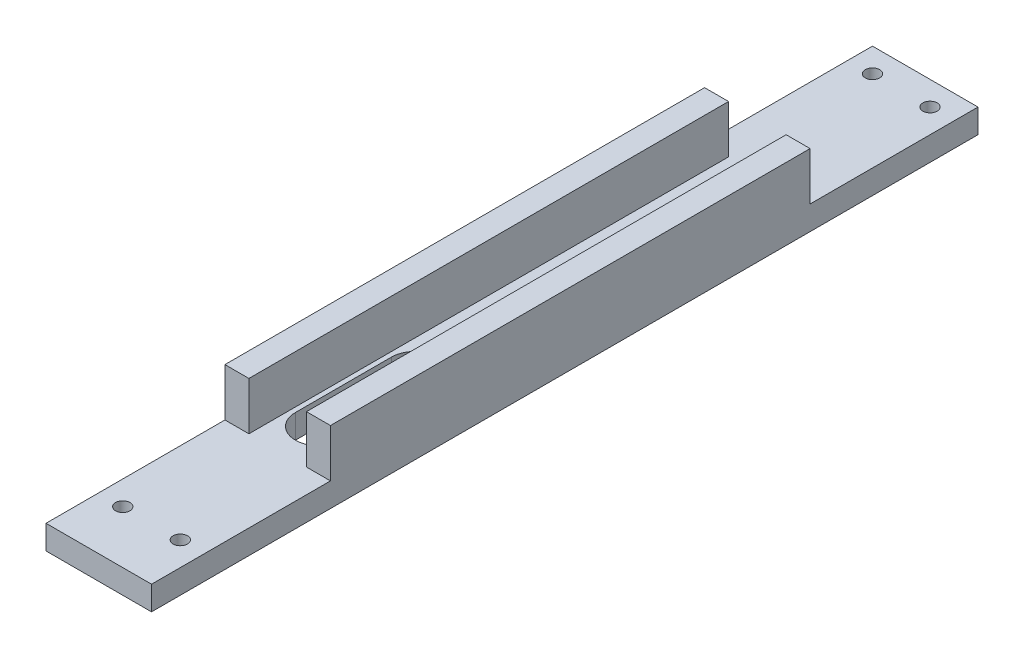
ISO-10303-21;
HEADER;
FILE_DESCRIPTION(('STEP AP214'),'2;1');
FILE_NAME('part.step','',(''),(''),'','','');
FILE_SCHEMA(('AUTOMOTIVE_DESIGN { 1 0 10303 214 1 1 1 1 }'));
ENDSEC;
DATA;
#1=APPLICATION_CONTEXT('core data for automotive mechanical design processes');
#2=APPLICATION_PROTOCOL_DEFINITION('international standard','automotive_design',2000,#1);
#3=PRODUCT_CONTEXT('',#1,'mechanical');
#4=PRODUCT('Part','Part','',(#3));
#5=PRODUCT_RELATED_PRODUCT_CATEGORY('part','',(#4));
#6=PRODUCT_DEFINITION_FORMATION('','',#4);
#7=PRODUCT_DEFINITION_CONTEXT('part definition',#1,'design');
#8=PRODUCT_DEFINITION('design','',#6,#7);
#9=PRODUCT_DEFINITION_SHAPE('','',#8);
#10=(LENGTH_UNIT() NAMED_UNIT(*) SI_UNIT(.MILLI.,.METRE.));
#11=(NAMED_UNIT(*) PLANE_ANGLE_UNIT() SI_UNIT($,.RADIAN.));
#12=(NAMED_UNIT(*) SI_UNIT($,.STERADIAN.) SOLID_ANGLE_UNIT());
#13=UNCERTAINTY_MEASURE_WITH_UNIT(LENGTH_MEASURE(1.E-05),#10,'distance_accuracy_value','');
#14=(GEOMETRIC_REPRESENTATION_CONTEXT(3) GLOBAL_UNCERTAINTY_ASSIGNED_CONTEXT((#13)) GLOBAL_UNIT_ASSIGNED_CONTEXT((#10,
#11,#12)) REPRESENTATION_CONTEXT('',''));
#15=CARTESIAN_POINT('',(0.,0.,0.));
#16=DIRECTION('',(0.,0.,1.));
#17=DIRECTION('',(1.,0.,0.));
#18=AXIS2_PLACEMENT_3D('',#15,#16,#17);
#19=CARTESIAN_POINT('',(0.,5.,0.));
#20=DIRECTION('',(0.,1.,0.));
#21=DIRECTION('',(0.,0.,1.));
#22=AXIS2_PLACEMENT_3D('',#19,#20,#21);
#23=PLANE('',#22);
#24=DIRECTION('',(0.,0.,-1.));
#25=VECTOR('',#24,1.);
#26=CARTESIAN_POINT('',(6.,5.,0.));
#27=LINE('',#26,#25);
#28=CARTESIAN_POINT('',(6.,5.,-40.));
#29=VERTEX_POINT('',#28);
#30=CARTESIAN_POINT('',(6.,5.,-60.));
#31=VERTEX_POINT('',#30);
#32=EDGE_CURVE('E225',#29,#31,#27,.T.);
#33=ORIENTED_EDGE('',*,*,#32,.T.);
#34=CARTESIAN_POINT('',(11.,5.,-60.));
#35=DIRECTION('',(0.,-1.,0.));
#36=DIRECTION('',(0.,0.,-1.));
#37=AXIS2_PLACEMENT_3D('',#34,#35,#36);
#38=CIRCLE('',#37,5.);
#39=CARTESIAN_POINT('',(16.,5.,-60.));
#40=VERTEX_POINT('',#39);
#41=EDGE_CURVE('E228',#31,#40,#38,.T.);
#42=ORIENTED_EDGE('',*,*,#41,.T.);
#43=DIRECTION('',(0.,0.,-1.));
#44=VECTOR('',#43,1.);
#45=CARTESIAN_POINT('',(16.,5.,0.));
#46=LINE('',#45,#44);
#47=CARTESIAN_POINT('',(16.,5.,-40.));
#48=VERTEX_POINT('',#47);
#49=EDGE_CURVE('E232',#48,#40,#46,.T.);
#50=ORIENTED_EDGE('',*,*,#49,.F.);
#51=CARTESIAN_POINT('',(11.,5.,-40.));
#52=DIRECTION('',(0.,-1.,0.));
#53=DIRECTION('',(0.,0.,-1.));
#54=AXIS2_PLACEMENT_3D('',#51,#52,#53);
#55=CIRCLE('',#54,5.);
#56=EDGE_CURVE('E235',#48,#29,#55,.T.);
#57=ORIENTED_EDGE('',*,*,#56,.T.);
#58=EDGE_LOOP('',(#33,#42,#50,#57));
#59=FACE_BOUND('',#58,.T.);
#60=CARTESIAN_POINT('',(17.,5.,-161.3));
#61=DIRECTION('',(0.,1.,0.));
#62=DIRECTION('',(0.,0.,1.));
#63=AXIS2_PLACEMENT_3D('',#60,#61,#62);
#64=CIRCLE('',#63,1.5);
#65=CARTESIAN_POINT('',(17.,5.,-159.8));
#66=VERTEX_POINT('',#65);
#67=EDGE_CURVE('E257',#66,#66,#64,.T.);
#68=ORIENTED_EDGE('',*,*,#67,.F.);
#69=EDGE_LOOP('',(#68));
#70=FACE_BOUND('',#69,.T.);
#71=CARTESIAN_POINT('',(5.,5.,-161.3));
#72=DIRECTION('',(0.,1.,0.));
#73=DIRECTION('',(0.,0.,1.));
#74=AXIS2_PLACEMENT_3D('',#71,#72,#73);
#75=CIRCLE('',#74,1.5);
#76=CARTESIAN_POINT('',(5.,5.,-159.8));
#77=VERTEX_POINT('',#76);
#78=EDGE_CURVE('E156',#77,#77,#75,.T.);
#79=ORIENTED_EDGE('',*,*,#78,.F.);
#80=EDGE_LOOP('',(#79));
#81=FACE_BOUND('',#80,.T.);
#82=CARTESIAN_POINT('',(17.,5.,-5.));
#83=DIRECTION('',(0.,1.,0.));
#84=DIRECTION('',(0.,0.,1.));
#85=AXIS2_PLACEMENT_3D('',#82,#83,#84);
#86=CIRCLE('',#85,1.5);
#87=CARTESIAN_POINT('',(17.,5.,-3.5));
#88=VERTEX_POINT('',#87);
#89=EDGE_CURVE('E269',#88,#88,#86,.F.);
#90=ORIENTED_EDGE('',*,*,#89,.T.);
#91=EDGE_LOOP('',(#90));
#92=FACE_BOUND('',#91,.T.);
#93=CARTESIAN_POINT('',(5.,5.,-5.));
#94=DIRECTION('',(0.,1.,0.));
#95=DIRECTION('',(0.,0.,1.));
#96=AXIS2_PLACEMENT_3D('',#93,#94,#95);
#97=CIRCLE('',#96,1.5);
#98=CARTESIAN_POINT('',(5.,5.,-3.5));
#99=VERTEX_POINT('',#98);
#100=EDGE_CURVE('E272',#99,#99,#97,.F.);
#101=ORIENTED_EDGE('',*,*,#100,.T.);
#102=EDGE_LOOP('',(#101));
#103=FACE_BOUND('',#102,.T.);
#104=DIRECTION('',(0.,0.,1.));
#105=VECTOR('',#104,1.);
#106=CARTESIAN_POINT('',(17.,5.,-131.3));
#107=LINE('',#106,#105);
#108=CARTESIAN_POINT('',(17.,5.,-131.3));
#109=VERTEX_POINT('',#108);
#110=CARTESIAN_POINT('',(17.,5.,-31.3));
#111=VERTEX_POINT('',#110);
#112=EDGE_CURVE('E50',#109,#111,#107,.T.);
#113=ORIENTED_EDGE('',*,*,#112,.F.);
#114=DIRECTION('',(-1.,0.,0.));
#115=VECTOR('',#114,1.);
#116=CARTESIAN_POINT('',(22.,5.,-131.3));
#117=LINE('',#116,#115);
#118=CARTESIAN_POINT('',(22.,5.,-131.3));
#119=VERTEX_POINT('',#118);
#120=EDGE_CURVE('E159',#119,#109,#117,.T.);
#121=ORIENTED_EDGE('',*,*,#120,.F.);
#122=DIRECTION('',(0.,0.,-1.));
#123=VECTOR('',#122,1.);
#124=CARTESIAN_POINT('',(22.,5.,0.));
#125=LINE('',#124,#123);
#126=CARTESIAN_POINT('',(22.,5.,-166.3));
#127=VERTEX_POINT('',#126);
#128=EDGE_CURVE('E146',#119,#127,#125,.T.);
#129=ORIENTED_EDGE('',*,*,#128,.T.);
#130=DIRECTION('',(1.,0.,0.));
#131=VECTOR('',#130,1.);
#132=CARTESIAN_POINT('',(0.,5.,-166.3));
#133=LINE('',#132,#131);
#134=CARTESIAN_POINT('',(0.,5.,-166.3));
#135=VERTEX_POINT('',#134);
#136=EDGE_CURVE('E263',#135,#127,#133,.T.);
#137=ORIENTED_EDGE('',*,*,#136,.F.);
#138=DIRECTION('',(0.,0.,-1.));
#139=VECTOR('',#138,1.);
#140=CARTESIAN_POINT('',(0.,5.,0.));
#141=LINE('',#140,#139);
#142=CARTESIAN_POINT('',(0.,5.,-131.3));
#143=VERTEX_POINT('',#142);
#144=EDGE_CURVE('E265',#143,#135,#141,.T.);
#145=ORIENTED_EDGE('',*,*,#144,.F.);
#146=DIRECTION('',(1.,0.,0.));
#147=VECTOR('',#146,1.);
#148=CARTESIAN_POINT('',(0.,5.,-131.3));
#149=LINE('',#148,#147);
#150=CARTESIAN_POINT('',(5.,5.,-131.3));
#151=VERTEX_POINT('',#150);
#152=EDGE_CURVE('E199',#143,#151,#149,.T.);
#153=ORIENTED_EDGE('',*,*,#152,.T.);
#154=DIRECTION('',(0.,0.,1.));
#155=VECTOR('',#154,1.);
#156=CARTESIAN_POINT('',(5.00000000000002,5.,0.));
#157=LINE('',#156,#155);
#158=CARTESIAN_POINT('',(5.00000000000001,5.,-31.3));
#159=VERTEX_POINT('',#158);
#160=EDGE_CURVE('E162',#151,#159,#157,.T.);
#161=ORIENTED_EDGE('',*,*,#160,.T.);
#162=DIRECTION('',(1.,0.,0.));
#163=VECTOR('',#162,1.);
#164=CARTESIAN_POINT('',(0.,5.,-31.3));
#165=LINE('',#164,#163);
#166=CARTESIAN_POINT('',(0.,5.,-31.3));
#167=VERTEX_POINT('',#166);
#168=EDGE_CURVE('E189',#167,#159,#165,.T.);
#169=ORIENTED_EDGE('',*,*,#168,.F.);
#170=CARTESIAN_POINT('',(0.,5.,6.));
#171=VERTEX_POINT('',#170);
#172=EDGE_CURVE('E266',#171,#167,#141,.T.);
#173=ORIENTED_EDGE('',*,*,#172,.F.);
#174=DIRECTION('',(-1.,0.,0.));
#175=VECTOR('',#174,1.);
#176=CARTESIAN_POINT('',(22.,5.,6.));
#177=LINE('',#176,#175);
#178=CARTESIAN_POINT('',(22.,5.,6.));
#179=VERTEX_POINT('',#178);
#180=EDGE_CURVE('E215',#179,#171,#177,.T.);
#181=ORIENTED_EDGE('',*,*,#180,.F.);
#182=CARTESIAN_POINT('',(22.,5.,-31.3));
#183=VERTEX_POINT('',#182);
#184=EDGE_CURVE('E155',#179,#183,#125,.T.);
#185=ORIENTED_EDGE('',*,*,#184,.T.);
#186=DIRECTION('',(-1.,0.,0.));
#187=VECTOR('',#186,1.);
#188=CARTESIAN_POINT('',(22.,5.,-31.3));
#189=LINE('',#188,#187);
#190=EDGE_CURVE('E55',#183,#111,#189,.T.);
#191=ORIENTED_EDGE('',*,*,#190,.T.);
#192=EDGE_LOOP('',(#113,#121,#129,#137,#145,#153,#161,#169,#173,#181,#185,#191));
#193=FACE_BOUND('',#192,.T.);
#194=ADVANCED_FACE('F35',(#59,#70,#81,#92,#103,#193),#23,.T.);
#195=CARTESIAN_POINT('',(22.,5.,0.));
#196=DIRECTION('',(-1.,0.,0.));
#197=DIRECTION('',(0.,0.,1.));
#198=AXIS2_PLACEMENT_3D('',#195,#196,#197);
#199=PLANE('',#198);
#200=DIRECTION('',(0.,0.,-1.));
#201=VECTOR('',#200,1.);
#202=CARTESIAN_POINT('',(22.,0.,0.));
#203=LINE('',#202,#201);
#204=CARTESIAN_POINT('',(22.,0.,6.));
#205=VERTEX_POINT('',#204);
#206=CARTESIAN_POINT('',(22.,0.,-166.3));
#207=VERTEX_POINT('',#206);
#208=EDGE_CURVE('E280',#205,#207,#203,.T.);
#209=ORIENTED_EDGE('',*,*,#208,.T.);
#210=DIRECTION('',(0.,-1.,0.));
#211=VECTOR('',#210,1.);
#212=CARTESIAN_POINT('',(22.,5.,-166.3));
#213=LINE('',#212,#211);
#214=EDGE_CURVE('E11',#127,#207,#213,.T.);
#215=ORIENTED_EDGE('',*,*,#214,.F.);
#216=ORIENTED_EDGE('',*,*,#128,.F.);
#217=DIRECTION('',(0.,-1.,0.));
#218=VECTOR('',#217,1.);
#219=CARTESIAN_POINT('',(22.,15.,-131.3));
#220=LINE('',#219,#218);
#221=CARTESIAN_POINT('',(22.,15.,-131.3));
#222=VERTEX_POINT('',#221);
#223=EDGE_CURVE('E151',#222,#119,#220,.T.);
#224=ORIENTED_EDGE('',*,*,#223,.F.);
#225=DIRECTION('',(0.,0.,1.));
#226=VECTOR('',#225,1.);
#227=CARTESIAN_POINT('',(22.,15.,-131.3));
#228=LINE('',#227,#226);
#229=CARTESIAN_POINT('',(22.,15.,-31.3));
#230=VERTEX_POINT('',#229);
#231=EDGE_CURVE('E168',#222,#230,#228,.T.);
#232=ORIENTED_EDGE('',*,*,#231,.T.);
#233=DIRECTION('',(0.,-1.,0.));
#234=VECTOR('',#233,1.);
#235=CARTESIAN_POINT('',(22.,15.,-31.3));
#236=LINE('',#235,#234);
#237=EDGE_CURVE('E169',#230,#183,#236,.T.);
#238=ORIENTED_EDGE('',*,*,#237,.T.);
#239=ORIENTED_EDGE('',*,*,#184,.F.);
#240=DIRECTION('',(0.,1.,0.));
#241=VECTOR('',#240,1.);
#242=CARTESIAN_POINT('',(22.,0.,6.));
#243=LINE('',#242,#241);
#244=EDGE_CURVE('E212',#205,#179,#243,.T.);
#245=ORIENTED_EDGE('',*,*,#244,.F.);
#246=EDGE_LOOP('',(#209,#215,#216,#224,#232,#238,#239,#245));
#247=FACE_BOUND('',#246,.T.);
#248=ADVANCED_FACE('F148',(#247),#199,.F.);
#249=CARTESIAN_POINT('',(0.,5.,-166.3));
#250=DIRECTION('',(0.,0.,-1.));
#251=DIRECTION('',(-1.,0.,0.));
#252=AXIS2_PLACEMENT_3D('',#249,#250,#251);
#253=PLANE('',#252);
#254=DIRECTION('',(1.,0.,0.));
#255=VECTOR('',#254,1.);
#256=CARTESIAN_POINT('',(0.,0.,-166.3));
#257=LINE('',#256,#255);
#258=CARTESIAN_POINT('',(0.,0.,-166.3));
#259=VERTEX_POINT('',#258);
#260=EDGE_CURVE('E282',#259,#207,#257,.T.);
#261=ORIENTED_EDGE('',*,*,#260,.F.);
#262=DIRECTION('',(0.,-1.,0.));
#263=VECTOR('',#262,1.);
#264=CARTESIAN_POINT('',(0.,5.,-166.3));
#265=LINE('',#264,#263);
#266=EDGE_CURVE('E43',#135,#259,#265,.T.);
#267=ORIENTED_EDGE('',*,*,#266,.F.);
#268=ORIENTED_EDGE('',*,*,#136,.T.);
#269=ORIENTED_EDGE('',*,*,#214,.T.);
#270=EDGE_LOOP('',(#261,#267,#268,#269));
#271=FACE_BOUND('',#270,.T.);
#272=ADVANCED_FACE('F299',(#271),#253,.T.);
#273=CARTESIAN_POINT('',(0.,5.,0.));
#274=DIRECTION('',(-1.,0.,0.));
#275=DIRECTION('',(0.,0.,1.));
#276=AXIS2_PLACEMENT_3D('',#273,#274,#275);
#277=PLANE('',#276);
#278=DIRECTION('',(0.,0.,-1.));
#279=VECTOR('',#278,1.);
#280=CARTESIAN_POINT('',(0.,0.,0.));
#281=LINE('',#280,#279);
#282=CARTESIAN_POINT('',(0.,0.,6.));
#283=VERTEX_POINT('',#282);
#284=EDGE_CURVE('E285',#283,#259,#281,.T.);
#285=ORIENTED_EDGE('',*,*,#284,.F.);
#286=DIRECTION('',(0.,-1.,0.));
#287=VECTOR('',#286,1.);
#288=CARTESIAN_POINT('',(0.,0.,6.));
#289=LINE('',#288,#287);
#290=EDGE_CURVE('E218',#171,#283,#289,.T.);
#291=ORIENTED_EDGE('',*,*,#290,.F.);
#292=ORIENTED_EDGE('',*,*,#172,.T.);
#293=DIRECTION('',(0.,-1.,0.));
#294=VECTOR('',#293,1.);
#295=CARTESIAN_POINT('',(0.,15.,-31.3));
#296=LINE('',#295,#294);
#297=CARTESIAN_POINT('',(0.,15.,-31.3));
#298=VERTEX_POINT('',#297);
#299=EDGE_CURVE('E205',#298,#167,#296,.T.);
#300=ORIENTED_EDGE('',*,*,#299,.F.);
#301=DIRECTION('',(0.,0.,1.));
#302=VECTOR('',#301,1.);
#303=CARTESIAN_POINT('',(0.,15.,0.));
#304=LINE('',#303,#302);
#305=CARTESIAN_POINT('',(0.,15.,-131.3));
#306=VERTEX_POINT('',#305);
#307=EDGE_CURVE('E192',#306,#298,#304,.T.);
#308=ORIENTED_EDGE('',*,*,#307,.F.);
#309=DIRECTION('',(0.,-1.,0.));
#310=VECTOR('',#309,1.);
#311=CARTESIAN_POINT('',(0.,15.,-131.3));
#312=LINE('',#311,#310);
#313=EDGE_CURVE('E207',#306,#143,#312,.T.);
#314=ORIENTED_EDGE('',*,*,#313,.T.);
#315=ORIENTED_EDGE('',*,*,#144,.T.);
#316=ORIENTED_EDGE('',*,*,#266,.T.);
#317=EDGE_LOOP('',(#285,#291,#292,#300,#308,#314,#315,#316));
#318=FACE_BOUND('',#317,.T.);
#319=ADVANCED_FACE('F295',(#318),#277,.T.);
#320=CARTESIAN_POINT('',(17.,5.,-5.));
#321=DIRECTION('',(0.,-1.,0.));
#322=DIRECTION('',(0.,0.,-1.));
#323=AXIS2_PLACEMENT_3D('',#320,#321,#322);
#324=CYLINDRICAL_SURFACE('',#323,1.5);
#325=ORIENTED_EDGE('',*,*,#89,.F.);
#326=EDGE_LOOP('',(#325));
#327=FACE_BOUND('',#326,.T.);
#328=CARTESIAN_POINT('',(17.,0.,-5.));
#329=DIRECTION('',(0.,1.,0.));
#330=DIRECTION('',(0.,0.,1.));
#331=AXIS2_PLACEMENT_3D('',#328,#329,#330);
#332=CIRCLE('',#331,1.5);
#333=CARTESIAN_POINT('',(17.,0.,-3.5));
#334=VERTEX_POINT('',#333);
#335=EDGE_CURVE('E288',#334,#334,#332,.F.);
#336=ORIENTED_EDGE('',*,*,#335,.T.);
#337=EDGE_LOOP('',(#336));
#338=FACE_BOUND('',#337,.T.);
#339=ADVANCED_FACE('F355',(#327,#338),#324,.F.);
#340=CARTESIAN_POINT('',(5.,5.,-161.3));
#341=DIRECTION('',(0.,-1.,0.));
#342=DIRECTION('',(0.,0.,-1.));
#343=AXIS2_PLACEMENT_3D('',#340,#341,#342);
#344=CYLINDRICAL_SURFACE('',#343,1.5);
#345=ORIENTED_EDGE('',*,*,#78,.T.);
#346=EDGE_LOOP('',(#345));
#347=FACE_BOUND('',#346,.T.);
#348=CARTESIAN_POINT('',(5.,0.,-161.3));
#349=DIRECTION('',(0.,1.,0.));
#350=DIRECTION('',(0.,0.,1.));
#351=AXIS2_PLACEMENT_3D('',#348,#349,#350);
#352=CIRCLE('',#351,1.5);
#353=CARTESIAN_POINT('',(5.,0.,-159.8));
#354=VERTEX_POINT('',#353);
#355=EDGE_CURVE('E277',#354,#354,#352,.T.);
#356=ORIENTED_EDGE('',*,*,#355,.F.);
#357=EDGE_LOOP('',(#356));
#358=FACE_BOUND('',#357,.T.);
#359=ADVANCED_FACE('F358',(#347,#358),#344,.F.);
#360=CARTESIAN_POINT('',(17.,5.,-161.3));
#361=DIRECTION('',(0.,-1.,0.));
#362=DIRECTION('',(0.,0.,-1.));
#363=AXIS2_PLACEMENT_3D('',#360,#361,#362);
#364=CYLINDRICAL_SURFACE('',#363,1.5);
#365=ORIENTED_EDGE('',*,*,#67,.T.);
#366=EDGE_LOOP('',(#365));
#367=FACE_BOUND('',#366,.T.);
#368=CARTESIAN_POINT('',(17.,0.,-161.3));
#369=DIRECTION('',(0.,1.,0.));
#370=DIRECTION('',(0.,0.,1.));
#371=AXIS2_PLACEMENT_3D('',#368,#369,#370);
#372=CIRCLE('',#371,1.5);
#373=CARTESIAN_POINT('',(17.,0.,-159.8));
#374=VERTEX_POINT('',#373);
#375=EDGE_CURVE('E250',#374,#374,#372,.T.);
#376=ORIENTED_EDGE('',*,*,#375,.F.);
#377=EDGE_LOOP('',(#376));
#378=FACE_BOUND('',#377,.T.);
#379=ADVANCED_FACE('F37',(#367,#378),#364,.F.);
#380=CARTESIAN_POINT('',(5.,5.,-5.));
#381=DIRECTION('',(0.,-1.,0.));
#382=DIRECTION('',(0.,0.,-1.));
#383=AXIS2_PLACEMENT_3D('',#380,#381,#382);
#384=CYLINDRICAL_SURFACE('',#383,1.5);
#385=ORIENTED_EDGE('',*,*,#100,.F.);
#386=EDGE_LOOP('',(#385));
#387=FACE_BOUND('',#386,.T.);
#388=CARTESIAN_POINT('',(5.,0.,-5.));
#389=DIRECTION('',(0.,1.,0.));
#390=DIRECTION('',(0.,0.,1.));
#391=AXIS2_PLACEMENT_3D('',#388,#389,#390);
#392=CIRCLE('',#391,1.5);
#393=CARTESIAN_POINT('',(5.,0.,-3.5));
#394=VERTEX_POINT('',#393);
#395=EDGE_CURVE('E260',#394,#394,#392,.F.);
#396=ORIENTED_EDGE('',*,*,#395,.T.);
#397=EDGE_LOOP('',(#396));
#398=FACE_BOUND('',#397,.T.);
#399=ADVANCED_FACE('F350',(#387,#398),#384,.F.);
#400=CARTESIAN_POINT('',(0.,0.,0.));
#401=DIRECTION('',(0.,1.,0.));
#402=DIRECTION('',(0.,0.,1.));
#403=AXIS2_PLACEMENT_3D('',#400,#401,#402);
#404=PLANE('',#403);
#405=CARTESIAN_POINT('',(11.,0.,-60.));
#406=DIRECTION('',(0.,-1.,0.));
#407=DIRECTION('',(0.,0.,-1.));
#408=AXIS2_PLACEMENT_3D('',#405,#406,#407);
#409=CIRCLE('',#408,5.);
#410=CARTESIAN_POINT('',(6.,0.,-60.));
#411=VERTEX_POINT('',#410);
#412=CARTESIAN_POINT('',(16.,0.,-60.));
#413=VERTEX_POINT('',#412);
#414=EDGE_CURVE('E240',#411,#413,#409,.T.);
#415=ORIENTED_EDGE('',*,*,#414,.F.);
#416=DIRECTION('',(0.,0.,-1.));
#417=VECTOR('',#416,1.);
#418=CARTESIAN_POINT('',(6.,0.,0.));
#419=LINE('',#418,#417);
#420=CARTESIAN_POINT('',(6.,0.,-40.));
#421=VERTEX_POINT('',#420);
#422=EDGE_CURVE('E224',#421,#411,#419,.T.);
#423=ORIENTED_EDGE('',*,*,#422,.F.);
#424=CARTESIAN_POINT('',(11.,0.,-40.));
#425=DIRECTION('',(0.,-1.,0.));
#426=DIRECTION('',(0.,0.,-1.));
#427=AXIS2_PLACEMENT_3D('',#424,#425,#426);
#428=CIRCLE('',#427,5.);
#429=CARTESIAN_POINT('',(16.,0.,-40.));
#430=VERTEX_POINT('',#429);
#431=EDGE_CURVE('E229',#430,#421,#428,.T.);
#432=ORIENTED_EDGE('',*,*,#431,.F.);
#433=DIRECTION('',(0.,0.,-1.));
#434=VECTOR('',#433,1.);
#435=CARTESIAN_POINT('',(16.,0.,0.));
#436=LINE('',#435,#434);
#437=EDGE_CURVE('E243',#430,#413,#436,.T.);
#438=ORIENTED_EDGE('',*,*,#437,.T.);
#439=EDGE_LOOP('',(#415,#423,#432,#438));
#440=FACE_BOUND('',#439,.T.);
#441=ORIENTED_EDGE('',*,*,#375,.T.);
#442=EDGE_LOOP('',(#441));
#443=FACE_BOUND('',#442,.T.);
#444=ORIENTED_EDGE('',*,*,#355,.T.);
#445=EDGE_LOOP('',(#444));
#446=FACE_BOUND('',#445,.T.);
#447=ORIENTED_EDGE('',*,*,#208,.F.);
#448=DIRECTION('',(1.,0.,0.));
#449=VECTOR('',#448,1.);
#450=CARTESIAN_POINT('',(22.,0.,6.));
#451=LINE('',#450,#449);
#452=EDGE_CURVE('E221',#283,#205,#451,.T.);
#453=ORIENTED_EDGE('',*,*,#452,.F.);
#454=ORIENTED_EDGE('',*,*,#284,.T.);
#455=ORIENTED_EDGE('',*,*,#260,.T.);
#456=EDGE_LOOP('',(#447,#453,#454,#455));
#457=FACE_BOUND('',#456,.T.);
#458=ORIENTED_EDGE('',*,*,#335,.F.);
#459=EDGE_LOOP('',(#458));
#460=FACE_BOUND('',#459,.T.);
#461=ORIENTED_EDGE('',*,*,#395,.F.);
#462=EDGE_LOOP('',(#461));
#463=FACE_BOUND('',#462,.T.);
#464=ADVANCED_FACE('F302',(#440,#443,#446,#457,#460,#463),#404,.F.);
#465=CARTESIAN_POINT('',(6.,5.,0.));
#466=DIRECTION('',(-1.,0.,0.));
#467=DIRECTION('',(0.,0.,1.));
#468=AXIS2_PLACEMENT_3D('',#465,#466,#467);
#469=PLANE('',#468);
#470=ORIENTED_EDGE('',*,*,#422,.T.);
#471=DIRECTION('',(0.,-1.,0.));
#472=VECTOR('',#471,1.);
#473=CARTESIAN_POINT('',(6.,5.,-60.));
#474=LINE('',#473,#472);
#475=EDGE_CURVE('E238',#31,#411,#474,.T.);
#476=ORIENTED_EDGE('',*,*,#475,.F.);
#477=ORIENTED_EDGE('',*,*,#32,.F.);
#478=DIRECTION('',(0.,-1.,0.));
#479=VECTOR('',#478,1.);
#480=CARTESIAN_POINT('',(6.,5.,-40.));
#481=LINE('',#480,#479);
#482=EDGE_CURVE('E248',#29,#421,#481,.T.);
#483=ORIENTED_EDGE('',*,*,#482,.T.);
#484=EDGE_LOOP('',(#470,#476,#477,#483));
#485=FACE_BOUND('',#484,.T.);
#486=ADVANCED_FACE('F346',(#485),#469,.F.);
#487=CARTESIAN_POINT('',(11.,5.,-40.));
#488=DIRECTION('',(0.,-1.,0.));
#489=DIRECTION('',(0.,0.,-1.));
#490=AXIS2_PLACEMENT_3D('',#487,#488,#489);
#491=CYLINDRICAL_SURFACE('',#490,5.);
#492=ORIENTED_EDGE('',*,*,#431,.T.);
#493=ORIENTED_EDGE('',*,*,#482,.F.);
#494=ORIENTED_EDGE('',*,*,#56,.F.);
#495=DIRECTION('',(0.,-1.,0.));
#496=VECTOR('',#495,1.);
#497=CARTESIAN_POINT('',(16.,5.,-40.));
#498=LINE('',#497,#496);
#499=EDGE_CURVE('E251',#48,#430,#498,.T.);
#500=ORIENTED_EDGE('',*,*,#499,.T.);
#501=EDGE_LOOP('',(#492,#493,#494,#500));
#502=FACE_BOUND('',#501,.T.);
#503=ADVANCED_FACE('F398',(#502),#491,.F.);
#504=CARTESIAN_POINT('',(16.,5.,0.));
#505=DIRECTION('',(-1.,0.,0.));
#506=DIRECTION('',(0.,0.,1.));
#507=AXIS2_PLACEMENT_3D('',#504,#505,#506);
#508=PLANE('',#507);
#509=ORIENTED_EDGE('',*,*,#437,.F.);
#510=ORIENTED_EDGE('',*,*,#499,.F.);
#511=ORIENTED_EDGE('',*,*,#49,.T.);
#512=DIRECTION('',(0.,-1.,0.));
#513=VECTOR('',#512,1.);
#514=CARTESIAN_POINT('',(16.,5.,-60.));
#515=LINE('',#514,#513);
#516=EDGE_CURVE('E253',#40,#413,#515,.T.);
#517=ORIENTED_EDGE('',*,*,#516,.T.);
#518=EDGE_LOOP('',(#509,#510,#511,#517));
#519=FACE_BOUND('',#518,.T.);
#520=ADVANCED_FACE('F405',(#519),#508,.T.);
#521=CARTESIAN_POINT('',(11.,5.,-60.));
#522=DIRECTION('',(0.,-1.,0.));
#523=DIRECTION('',(0.,0.,-1.));
#524=AXIS2_PLACEMENT_3D('',#521,#522,#523);
#525=CYLINDRICAL_SURFACE('',#524,5.);
#526=ORIENTED_EDGE('',*,*,#414,.T.);
#527=ORIENTED_EDGE('',*,*,#516,.F.);
#528=ORIENTED_EDGE('',*,*,#41,.F.);
#529=ORIENTED_EDGE('',*,*,#475,.T.);
#530=EDGE_LOOP('',(#526,#527,#528,#529));
#531=FACE_BOUND('',#530,.T.);
#532=ADVANCED_FACE('F332',(#531),#525,.F.);
#533=CARTESIAN_POINT('',(0.,0.,6.));
#534=DIRECTION('',(0.,0.,1.));
#535=DIRECTION('',(1.,0.,0.));
#536=AXIS2_PLACEMENT_3D('',#533,#534,#535);
#537=PLANE('',#536);
#538=ORIENTED_EDGE('',*,*,#244,.T.);
#539=ORIENTED_EDGE('',*,*,#180,.T.);
#540=ORIENTED_EDGE('',*,*,#290,.T.);
#541=ORIENTED_EDGE('',*,*,#452,.T.);
#542=EDGE_LOOP('',(#538,#539,#540,#541));
#543=FACE_BOUND('',#542,.T.);
#544=ADVANCED_FACE('F306',(#543),#537,.T.);
#545=CARTESIAN_POINT('',(5.00000000000002,15.,0.));
#546=DIRECTION('',(1.,0.,0.));
#547=DIRECTION('',(0.,0.,-1.));
#548=AXIS2_PLACEMENT_3D('',#545,#546,#547);
#549=PLANE('',#548);
#550=ORIENTED_EDGE('',*,*,#160,.F.);
#551=DIRECTION('',(0.,-1.,0.));
#552=VECTOR('',#551,1.);
#553=CARTESIAN_POINT('',(5.,15.,-131.3));
#554=LINE('',#553,#552);
#555=CARTESIAN_POINT('',(5.,15.,-131.3));
#556=VERTEX_POINT('',#555);
#557=EDGE_CURVE('E209',#556,#151,#554,.T.);
#558=ORIENTED_EDGE('',*,*,#557,.F.);
#559=DIRECTION('',(0.,0.,1.));
#560=VECTOR('',#559,1.);
#561=CARTESIAN_POINT('',(5.00000000000002,15.,0.));
#562=LINE('',#561,#560);
#563=CARTESIAN_POINT('',(5.00000000000001,15.,-31.3));
#564=VERTEX_POINT('',#563);
#565=EDGE_CURVE('E185',#556,#564,#562,.T.);
#566=ORIENTED_EDGE('',*,*,#565,.T.);
#567=DIRECTION('',(0.,-1.,0.));
#568=VECTOR('',#567,1.);
#569=CARTESIAN_POINT('',(5.00000000000001,15.,-31.3));
#570=LINE('',#569,#568);
#571=EDGE_CURVE('E196',#564,#159,#570,.T.);
#572=ORIENTED_EDGE('',*,*,#571,.T.);
#573=EDGE_LOOP('',(#550,#558,#566,#572));
#574=FACE_BOUND('',#573,.T.);
#575=ADVANCED_FACE('F323',(#574),#549,.T.);
#576=CARTESIAN_POINT('',(0.,15.,-131.3));
#577=DIRECTION('',(0.,0.,-1.));
#578=DIRECTION('',(-1.,0.,0.));
#579=AXIS2_PLACEMENT_3D('',#576,#577,#578);
#580=PLANE('',#579);
#581=ORIENTED_EDGE('',*,*,#152,.F.);
#582=ORIENTED_EDGE('',*,*,#313,.F.);
#583=DIRECTION('',(1.,0.,0.));
#584=VECTOR('',#583,1.);
#585=CARTESIAN_POINT('',(0.,15.,-131.3));
#586=LINE('',#585,#584);
#587=EDGE_CURVE('E188',#306,#556,#586,.T.);
#588=ORIENTED_EDGE('',*,*,#587,.T.);
#589=ORIENTED_EDGE('',*,*,#557,.T.);
#590=EDGE_LOOP('',(#581,#582,#588,#589));
#591=FACE_BOUND('',#590,.T.);
#592=ADVANCED_FACE('F321',(#591),#580,.T.);
#593=CARTESIAN_POINT('',(0.,15.,-31.3));
#594=DIRECTION('',(0.,0.,-1.));
#595=DIRECTION('',(-1.,0.,0.));
#596=AXIS2_PLACEMENT_3D('',#593,#594,#595);
#597=PLANE('',#596);
#598=ORIENTED_EDGE('',*,*,#168,.T.);
#599=ORIENTED_EDGE('',*,*,#571,.F.);
#600=DIRECTION('',(1.,0.,0.));
#601=VECTOR('',#600,1.);
#602=CARTESIAN_POINT('',(0.,15.,-31.3));
#603=LINE('',#602,#601);
#604=EDGE_CURVE('E194',#298,#564,#603,.T.);
#605=ORIENTED_EDGE('',*,*,#604,.F.);
#606=ORIENTED_EDGE('',*,*,#299,.T.);
#607=EDGE_LOOP('',(#598,#599,#605,#606));
#608=FACE_BOUND('',#607,.T.);
#609=ADVANCED_FACE('F315',(#608),#597,.F.);
#610=CARTESIAN_POINT('',(0.,15.,0.));
#611=DIRECTION('',(0.,1.,0.));
#612=DIRECTION('',(0.,0.,1.));
#613=AXIS2_PLACEMENT_3D('',#610,#611,#612);
#614=PLANE('',#613);
#615=ORIENTED_EDGE('',*,*,#565,.F.);
#616=ORIENTED_EDGE('',*,*,#587,.F.);
#617=ORIENTED_EDGE('',*,*,#307,.T.);
#618=ORIENTED_EDGE('',*,*,#604,.T.);
#619=EDGE_LOOP('',(#615,#616,#617,#618));
#620=FACE_BOUND('',#619,.T.);
#621=ADVANCED_FACE('F318',(#620),#614,.T.);
#622=CARTESIAN_POINT('',(22.,15.,-131.3));
#623=DIRECTION('',(0.,0.,1.));
#624=DIRECTION('',(1.,0.,0.));
#625=AXIS2_PLACEMENT_3D('',#622,#623,#624);
#626=PLANE('',#625);
#627=ORIENTED_EDGE('',*,*,#120,.T.);
#628=DIRECTION('',(0.,-1.,0.));
#629=VECTOR('',#628,1.);
#630=CARTESIAN_POINT('',(17.,15.,-131.3));
#631=LINE('',#630,#629);
#632=CARTESIAN_POINT('',(17.,15.,-131.3));
#633=VERTEX_POINT('',#632);
#634=EDGE_CURVE('E511',#633,#109,#631,.T.);
#635=ORIENTED_EDGE('',*,*,#634,.F.);
#636=DIRECTION('',(-1.,0.,0.));
#637=VECTOR('',#636,1.);
#638=CARTESIAN_POINT('',(22.,15.,-131.3));
#639=LINE('',#638,#637);
#640=EDGE_CURVE('E166',#222,#633,#639,.T.);
#641=ORIENTED_EDGE('',*,*,#640,.F.);
#642=ORIENTED_EDGE('',*,*,#223,.T.);
#643=EDGE_LOOP('',(#627,#635,#641,#642));
#644=FACE_BOUND('',#643,.T.);
#645=ADVANCED_FACE('F164',(#644),#626,.F.);
#646=CARTESIAN_POINT('',(17.,15.,-131.3));
#647=DIRECTION('',(1.,0.,0.));
#648=DIRECTION('',(0.,0.,-1.));
#649=AXIS2_PLACEMENT_3D('',#646,#647,#648);
#650=PLANE('',#649);
#651=ORIENTED_EDGE('',*,*,#112,.T.);
#652=DIRECTION('',(0.,-1.,0.));
#653=VECTOR('',#652,1.);
#654=CARTESIAN_POINT('',(17.,15.,-31.3));
#655=LINE('',#654,#653);
#656=CARTESIAN_POINT('',(17.,15.,-31.3));
#657=VERTEX_POINT('',#656);
#658=EDGE_CURVE('E174',#657,#111,#655,.T.);
#659=ORIENTED_EDGE('',*,*,#658,.F.);
#660=DIRECTION('',(0.,0.,1.));
#661=VECTOR('',#660,1.);
#662=CARTESIAN_POINT('',(17.,15.,-131.3));
#663=LINE('',#662,#661);
#664=EDGE_CURVE('E182',#633,#657,#663,.T.);
#665=ORIENTED_EDGE('',*,*,#664,.F.);
#666=ORIENTED_EDGE('',*,*,#634,.T.);
#667=EDGE_LOOP('',(#651,#659,#665,#666));
#668=FACE_BOUND('',#667,.T.);
#669=ADVANCED_FACE('F476',(#668),#650,.F.);
#670=CARTESIAN_POINT('',(22.,15.,-31.3));
#671=DIRECTION('',(0.,0.,1.));
#672=DIRECTION('',(1.,0.,0.));
#673=AXIS2_PLACEMENT_3D('',#670,#671,#672);
#674=PLANE('',#673);
#675=ORIENTED_EDGE('',*,*,#190,.F.);
#676=ORIENTED_EDGE('',*,*,#237,.F.);
#677=DIRECTION('',(-1.,0.,0.));
#678=VECTOR('',#677,1.);
#679=CARTESIAN_POINT('',(22.,15.,-31.3));
#680=LINE('',#679,#678);
#681=EDGE_CURVE('E171',#230,#657,#680,.T.);
#682=ORIENTED_EDGE('',*,*,#681,.T.);
#683=ORIENTED_EDGE('',*,*,#658,.T.);
#684=EDGE_LOOP('',(#675,#676,#682,#683));
#685=FACE_BOUND('',#684,.T.);
#686=ADVANCED_FACE('F485',(#685),#674,.T.);
#687=CARTESIAN_POINT('',(0.,15.,0.));
#688=DIRECTION('',(0.,1.,0.));
#689=DIRECTION('',(0.,0.,1.));
#690=AXIS2_PLACEMENT_3D('',#687,#688,#689);
#691=PLANE('',#690);
#692=ORIENTED_EDGE('',*,*,#640,.T.);
#693=ORIENTED_EDGE('',*,*,#664,.T.);
#694=ORIENTED_EDGE('',*,*,#681,.F.);
#695=ORIENTED_EDGE('',*,*,#231,.F.);
#696=EDGE_LOOP('',(#692,#693,#694,#695));
#697=FACE_BOUND('',#696,.T.);
#698=ADVANCED_FACE('F495',(#697),#691,.T.);
#699=CLOSED_SHELL('',(#194,#248,#272,#319,#339,#359,#379,#399,#464,#486,#503,#520,#532,#544,
#575,#592,#609,#621,#645,#669,#686,#698));
#700=MANIFOLD_SOLID_BREP('B2',#699);
#701=ADVANCED_BREP_SHAPE_REPRESENTATION('',(#18,#700),#14);
#702=SHAPE_DEFINITION_REPRESENTATION(#9,#701);
ENDSEC;
END-ISO-10303-21;
